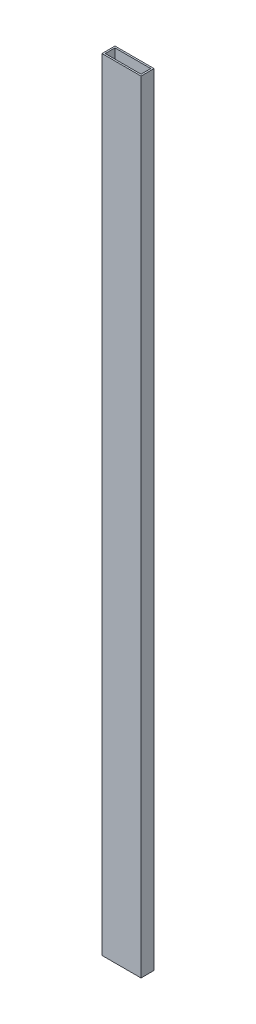
ISO-10303-21;
HEADER;
FILE_DESCRIPTION(('STEP AP214'),'2;1');
FILE_NAME('part.step','',(''),(''),'','','');
FILE_SCHEMA(('AUTOMOTIVE_DESIGN { 1 0 10303 214 1 1 1 1 }'));
ENDSEC;
DATA;
#1=APPLICATION_CONTEXT('core data for automotive mechanical design processes');
#2=APPLICATION_PROTOCOL_DEFINITION('international standard','automotive_design',2000,#1);
#3=PRODUCT_CONTEXT('',#1,'mechanical');
#4=PRODUCT('Part','Part','',(#3));
#5=PRODUCT_RELATED_PRODUCT_CATEGORY('part','',(#4));
#6=PRODUCT_DEFINITION_FORMATION('','',#4);
#7=PRODUCT_DEFINITION_CONTEXT('part definition',#1,'design');
#8=PRODUCT_DEFINITION('design','',#6,#7);
#9=PRODUCT_DEFINITION_SHAPE('','',#8);
#10=(LENGTH_UNIT() NAMED_UNIT(*) SI_UNIT(.MILLI.,.METRE.));
#11=(NAMED_UNIT(*) PLANE_ANGLE_UNIT() SI_UNIT($,.RADIAN.));
#12=(NAMED_UNIT(*) SI_UNIT($,.STERADIAN.) SOLID_ANGLE_UNIT());
#13=UNCERTAINTY_MEASURE_WITH_UNIT(LENGTH_MEASURE(1.E-05),#10,'distance_accuracy_value','');
#14=(GEOMETRIC_REPRESENTATION_CONTEXT(3) GLOBAL_UNCERTAINTY_ASSIGNED_CONTEXT((#13)) GLOBAL_UNIT_ASSIGNED_CONTEXT((#10,
#11,#12)) REPRESENTATION_CONTEXT('',''));
#15=CARTESIAN_POINT('',(0.,0.,0.));
#16=DIRECTION('',(0.,0.,1.));
#17=DIRECTION('',(1.,0.,0.));
#18=AXIS2_PLACEMENT_3D('',#15,#16,#17);
#19=CARTESIAN_POINT('',(0.,1524.,0.));
#20=DIRECTION('',(0.,1.,0.));
#21=DIRECTION('',(0.,0.,1.));
#22=AXIS2_PLACEMENT_3D('',#19,#20,#21);
#23=PLANE('',#22);
#24=DIRECTION('',(0.,0.,-1.));
#25=VECTOR('',#24,1.);
#26=CARTESIAN_POINT('',(0.,1524.,0.));
#27=LINE('',#26,#25);
#28=CARTESIAN_POINT('',(0.,1524.,0.));
#29=VERTEX_POINT('',#28);
#30=CARTESIAN_POINT('',(0.,1524.,-25.4));
#31=VERTEX_POINT('',#30);
#32=EDGE_CURVE('E136',#29,#31,#27,.T.);
#33=ORIENTED_EDGE('',*,*,#32,.T.);
#34=DIRECTION('',(-1.,0.,0.));
#35=VECTOR('',#34,1.);
#36=CARTESIAN_POINT('',(0.,1524.,-25.4));
#37=LINE('',#36,#35);
#38=CARTESIAN_POINT('',(-76.2,1524.,-25.4));
#39=VERTEX_POINT('',#38);
#40=EDGE_CURVE('E139',#31,#39,#37,.T.);
#41=ORIENTED_EDGE('',*,*,#40,.T.);
#42=DIRECTION('',(0.,0.,1.));
#43=VECTOR('',#42,1.);
#44=CARTESIAN_POINT('',(-76.2,1524.,0.));
#45=LINE('',#44,#43);
#46=CARTESIAN_POINT('',(-76.2,1524.,0.));
#47=VERTEX_POINT('',#46);
#48=EDGE_CURVE('E142',#39,#47,#45,.T.);
#49=ORIENTED_EDGE('',*,*,#48,.T.);
#50=DIRECTION('',(1.,0.,0.));
#51=VECTOR('',#50,1.);
#52=CARTESIAN_POINT('',(0.,1524.,0.));
#53=LINE('',#52,#51);
#54=EDGE_CURVE('E144',#47,#29,#53,.T.);
#55=ORIENTED_EDGE('',*,*,#54,.T.);
#56=EDGE_LOOP('',(#33,#41,#49,#55));
#57=FACE_BOUND('',#56,.T.);
#58=DIRECTION('',(1.,0.,0.));
#59=VECTOR('',#58,1.);
#60=CARTESIAN_POINT('',(-73.025,1524.,-3.17499999999999));
#61=LINE('',#60,#59);
#62=CARTESIAN_POINT('',(-73.025,1524.,-3.17499999999999));
#63=VERTEX_POINT('',#62);
#64=CARTESIAN_POINT('',(-3.175,1524.,-3.17499999999999));
#65=VERTEX_POINT('',#64);
#66=EDGE_CURVE('E108',#63,#65,#61,.T.);
#67=ORIENTED_EDGE('',*,*,#66,.F.);
#68=DIRECTION('',(0.,0.,1.));
#69=VECTOR('',#68,1.);
#70=CARTESIAN_POINT('',(-73.025,1524.,-22.225));
#71=LINE('',#70,#69);
#72=CARTESIAN_POINT('',(-73.025,1524.,-22.225));
#73=VERTEX_POINT('',#72);
#74=EDGE_CURVE('E100',#73,#63,#71,.T.);
#75=ORIENTED_EDGE('',*,*,#74,.F.);
#76=DIRECTION('',(-1.,0.,0.));
#77=VECTOR('',#76,1.);
#78=CARTESIAN_POINT('',(-73.025,1524.,-22.225));
#79=LINE('',#78,#77);
#80=CARTESIAN_POINT('',(-3.175,1524.,-22.225));
#81=VERTEX_POINT('',#80);
#82=EDGE_CURVE('E122',#81,#73,#79,.T.);
#83=ORIENTED_EDGE('',*,*,#82,.F.);
#84=DIRECTION('',(0.,0.,-1.));
#85=VECTOR('',#84,1.);
#86=CARTESIAN_POINT('',(-3.175,1524.,-22.225));
#87=LINE('',#86,#85);
#88=EDGE_CURVE('E120',#65,#81,#87,.T.);
#89=ORIENTED_EDGE('',*,*,#88,.F.);
#90=EDGE_LOOP('',(#67,#75,#83,#89));
#91=FACE_BOUND('',#90,.T.);
#92=ADVANCED_FACE('F35',(#57,#91),#23,.T.);
#93=CARTESIAN_POINT('',(0.,0.,0.));
#94=DIRECTION('',(0.,1.,0.));
#95=DIRECTION('',(0.,0.,1.));
#96=AXIS2_PLACEMENT_3D('',#93,#94,#95);
#97=PLANE('',#96);
#98=DIRECTION('',(0.,0.,-1.));
#99=VECTOR('',#98,1.);
#100=CARTESIAN_POINT('',(0.,0.,0.));
#101=LINE('',#100,#99);
#102=CARTESIAN_POINT('',(0.,0.,0.));
#103=VERTEX_POINT('',#102);
#104=CARTESIAN_POINT('',(0.,0.,-25.4));
#105=VERTEX_POINT('',#104);
#106=EDGE_CURVE('E116',#103,#105,#101,.T.);
#107=ORIENTED_EDGE('',*,*,#106,.F.);
#108=DIRECTION('',(1.,0.,0.));
#109=VECTOR('',#108,1.);
#110=CARTESIAN_POINT('',(0.,0.,0.));
#111=LINE('',#110,#109);
#112=CARTESIAN_POINT('',(-76.2,0.,0.));
#113=VERTEX_POINT('',#112);
#114=EDGE_CURVE('E140',#113,#103,#111,.T.);
#115=ORIENTED_EDGE('',*,*,#114,.F.);
#116=DIRECTION('',(0.,0.,1.));
#117=VECTOR('',#116,1.);
#118=CARTESIAN_POINT('',(-76.2,0.,0.));
#119=LINE('',#118,#117);
#120=CARTESIAN_POINT('',(-76.2,0.,-25.4));
#121=VERTEX_POINT('',#120);
#122=EDGE_CURVE('E151',#121,#113,#119,.T.);
#123=ORIENTED_EDGE('',*,*,#122,.F.);
#124=DIRECTION('',(-1.,0.,0.));
#125=VECTOR('',#124,1.);
#126=CARTESIAN_POINT('',(0.,0.,-25.4));
#127=LINE('',#126,#125);
#128=EDGE_CURVE('E149',#105,#121,#127,.T.);
#129=ORIENTED_EDGE('',*,*,#128,.F.);
#130=EDGE_LOOP('',(#107,#115,#123,#129));
#131=FACE_BOUND('',#130,.T.);
#132=DIRECTION('',(0.,0.,1.));
#133=VECTOR('',#132,1.);
#134=CARTESIAN_POINT('',(-73.025,0.,-22.225));
#135=LINE('',#134,#133);
#136=CARTESIAN_POINT('',(-73.025,0.,-22.225));
#137=VERTEX_POINT('',#136);
#138=CARTESIAN_POINT('',(-73.025,0.,-3.17499999999999));
#139=VERTEX_POINT('',#138);
#140=EDGE_CURVE('E58',#137,#139,#135,.T.);
#141=ORIENTED_EDGE('',*,*,#140,.T.);
#142=DIRECTION('',(1.,0.,0.));
#143=VECTOR('',#142,1.);
#144=CARTESIAN_POINT('',(-73.025,0.,-3.17499999999999));
#145=LINE('',#144,#143);
#146=CARTESIAN_POINT('',(-3.175,0.,-3.17499999999999));
#147=VERTEX_POINT('',#146);
#148=EDGE_CURVE('E115',#139,#147,#145,.T.);
#149=ORIENTED_EDGE('',*,*,#148,.T.);
#150=DIRECTION('',(0.,0.,-1.));
#151=VECTOR('',#150,1.);
#152=CARTESIAN_POINT('',(-3.175,0.,-22.225));
#153=LINE('',#152,#151);
#154=CARTESIAN_POINT('',(-3.175,0.,-22.225));
#155=VERTEX_POINT('',#154);
#156=EDGE_CURVE('E128',#147,#155,#153,.T.);
#157=ORIENTED_EDGE('',*,*,#156,.T.);
#158=DIRECTION('',(-1.,0.,0.));
#159=VECTOR('',#158,1.);
#160=CARTESIAN_POINT('',(-73.025,0.,-22.225));
#161=LINE('',#160,#159);
#162=EDGE_CURVE('E109',#155,#137,#161,.T.);
#163=ORIENTED_EDGE('',*,*,#162,.T.);
#164=EDGE_LOOP('',(#141,#149,#157,#163));
#165=FACE_BOUND('',#164,.T.);
#166=ADVANCED_FACE('F169',(#131,#165),#97,.F.);
#167=CARTESIAN_POINT('',(0.,1524.,0.));
#168=DIRECTION('',(-1.,0.,0.));
#169=DIRECTION('',(0.,0.,1.));
#170=AXIS2_PLACEMENT_3D('',#167,#168,#169);
#171=PLANE('',#170);
#172=ORIENTED_EDGE('',*,*,#106,.T.);
#173=DIRECTION('',(0.,-1.,0.));
#174=VECTOR('',#173,1.);
#175=CARTESIAN_POINT('',(0.,1524.,-25.4));
#176=LINE('',#175,#174);
#177=EDGE_CURVE('E11',#31,#105,#176,.T.);
#178=ORIENTED_EDGE('',*,*,#177,.F.);
#179=ORIENTED_EDGE('',*,*,#32,.F.);
#180=DIRECTION('',(0.,-1.,0.));
#181=VECTOR('',#180,1.);
#182=CARTESIAN_POINT('',(0.,1524.,0.));
#183=LINE('',#182,#181);
#184=EDGE_CURVE('E146',#29,#103,#183,.T.);
#185=ORIENTED_EDGE('',*,*,#184,.T.);
#186=EDGE_LOOP('',(#172,#178,#179,#185));
#187=FACE_BOUND('',#186,.T.);
#188=ADVANCED_FACE('F37',(#187),#171,.F.);
#189=CARTESIAN_POINT('',(0.,1524.,-25.4));
#190=DIRECTION('',(0.,0.,1.));
#191=DIRECTION('',(1.,0.,0.));
#192=AXIS2_PLACEMENT_3D('',#189,#190,#191);
#193=PLANE('',#192);
#194=ORIENTED_EDGE('',*,*,#128,.T.);
#195=DIRECTION('',(0.,-1.,0.));
#196=VECTOR('',#195,1.);
#197=CARTESIAN_POINT('',(-76.2,1524.,-25.4));
#198=LINE('',#197,#196);
#199=EDGE_CURVE('E43',#39,#121,#198,.T.);
#200=ORIENTED_EDGE('',*,*,#199,.F.);
#201=ORIENTED_EDGE('',*,*,#40,.F.);
#202=ORIENTED_EDGE('',*,*,#177,.T.);
#203=EDGE_LOOP('',(#194,#200,#201,#202));
#204=FACE_BOUND('',#203,.T.);
#205=ADVANCED_FACE('F179',(#204),#193,.F.);
#206=CARTESIAN_POINT('',(-76.2,1524.,0.));
#207=DIRECTION('',(1.,0.,0.));
#208=DIRECTION('',(0.,0.,-1.));
#209=AXIS2_PLACEMENT_3D('',#206,#207,#208);
#210=PLANE('',#209);
#211=ORIENTED_EDGE('',*,*,#122,.T.);
#212=DIRECTION('',(0.,-1.,0.));
#213=VECTOR('',#212,1.);
#214=CARTESIAN_POINT('',(-76.2,1524.,0.));
#215=LINE('',#214,#213);
#216=EDGE_CURVE('E156',#47,#113,#215,.T.);
#217=ORIENTED_EDGE('',*,*,#216,.F.);
#218=ORIENTED_EDGE('',*,*,#48,.F.);
#219=ORIENTED_EDGE('',*,*,#199,.T.);
#220=EDGE_LOOP('',(#211,#217,#218,#219));
#221=FACE_BOUND('',#220,.T.);
#222=ADVANCED_FACE('F163',(#221),#210,.F.);
#223=CARTESIAN_POINT('',(0.,1524.,0.));
#224=DIRECTION('',(0.,0.,-1.));
#225=DIRECTION('',(-1.,0.,0.));
#226=AXIS2_PLACEMENT_3D('',#223,#224,#225);
#227=PLANE('',#226);
#228=ORIENTED_EDGE('',*,*,#114,.T.);
#229=ORIENTED_EDGE('',*,*,#184,.F.);
#230=ORIENTED_EDGE('',*,*,#54,.F.);
#231=ORIENTED_EDGE('',*,*,#216,.T.);
#232=EDGE_LOOP('',(#228,#229,#230,#231));
#233=FACE_BOUND('',#232,.T.);
#234=ADVANCED_FACE('F173',(#233),#227,.F.);
#235=CARTESIAN_POINT('',(-73.025,1524.,-22.225));
#236=DIRECTION('',(1.,0.,0.));
#237=DIRECTION('',(0.,0.,-1.));
#238=AXIS2_PLACEMENT_3D('',#235,#236,#237);
#239=PLANE('',#238);
#240=ORIENTED_EDGE('',*,*,#140,.F.);
#241=DIRECTION('',(0.,-1.,0.));
#242=VECTOR('',#241,1.);
#243=CARTESIAN_POINT('',(-73.025,1524.,-22.225));
#244=LINE('',#243,#242);
#245=EDGE_CURVE('E104',#73,#137,#244,.T.);
#246=ORIENTED_EDGE('',*,*,#245,.F.);
#247=ORIENTED_EDGE('',*,*,#74,.T.);
#248=DIRECTION('',(0.,-1.,0.));
#249=VECTOR('',#248,1.);
#250=CARTESIAN_POINT('',(-73.025,1524.,-3.17499999999999));
#251=LINE('',#250,#249);
#252=EDGE_CURVE('E103',#63,#139,#251,.T.);
#253=ORIENTED_EDGE('',*,*,#252,.T.);
#254=EDGE_LOOP('',(#240,#246,#247,#253));
#255=FACE_BOUND('',#254,.T.);
#256=ADVANCED_FACE('F102',(#255),#239,.T.);
#257=CARTESIAN_POINT('',(-73.025,1524.,-3.17499999999999));
#258=DIRECTION('',(0.,0.,-1.));
#259=DIRECTION('',(-1.,0.,0.));
#260=AXIS2_PLACEMENT_3D('',#257,#258,#259);
#261=PLANE('',#260);
#262=ORIENTED_EDGE('',*,*,#148,.F.);
#263=ORIENTED_EDGE('',*,*,#252,.F.);
#264=ORIENTED_EDGE('',*,*,#66,.T.);
#265=DIRECTION('',(0.,-1.,0.));
#266=VECTOR('',#265,1.);
#267=CARTESIAN_POINT('',(-3.175,1524.,-3.17499999999999));
#268=LINE('',#267,#266);
#269=EDGE_CURVE('E117',#65,#147,#268,.T.);
#270=ORIENTED_EDGE('',*,*,#269,.T.);
#271=EDGE_LOOP('',(#262,#263,#264,#270));
#272=FACE_BOUND('',#271,.T.);
#273=ADVANCED_FACE('F112',(#272),#261,.T.);
#274=CARTESIAN_POINT('',(-3.175,1524.,-22.225));
#275=DIRECTION('',(-1.,0.,0.));
#276=DIRECTION('',(0.,0.,1.));
#277=AXIS2_PLACEMENT_3D('',#274,#275,#276);
#278=PLANE('',#277);
#279=ORIENTED_EDGE('',*,*,#156,.F.);
#280=ORIENTED_EDGE('',*,*,#269,.F.);
#281=ORIENTED_EDGE('',*,*,#88,.T.);
#282=DIRECTION('',(0.,-1.,0.));
#283=VECTOR('',#282,1.);
#284=CARTESIAN_POINT('',(-3.175,1524.,-22.225));
#285=LINE('',#284,#283);
#286=EDGE_CURVE('E50',#81,#155,#285,.T.);
#287=ORIENTED_EDGE('',*,*,#286,.T.);
#288=EDGE_LOOP('',(#279,#280,#281,#287));
#289=FACE_BOUND('',#288,.T.);
#290=ADVANCED_FACE('F202',(#289),#278,.T.);
#291=CARTESIAN_POINT('',(-73.025,1524.,-22.225));
#292=DIRECTION('',(0.,0.,1.));
#293=DIRECTION('',(1.,0.,0.));
#294=AXIS2_PLACEMENT_3D('',#291,#292,#293);
#295=PLANE('',#294);
#296=ORIENTED_EDGE('',*,*,#162,.F.);
#297=ORIENTED_EDGE('',*,*,#286,.F.);
#298=ORIENTED_EDGE('',*,*,#82,.T.);
#299=ORIENTED_EDGE('',*,*,#245,.T.);
#300=EDGE_LOOP('',(#296,#297,#298,#299));
#301=FACE_BOUND('',#300,.T.);
#302=ADVANCED_FACE('F206',(#301),#295,.T.);
#303=CLOSED_SHELL('',(#92,#166,#188,#205,#222,#234,#256,#273,#290,#302));
#304=MANIFOLD_SOLID_BREP('B2',#303);
#305=ADVANCED_BREP_SHAPE_REPRESENTATION('',(#18,#304),#14);
#306=SHAPE_DEFINITION_REPRESENTATION(#9,#305);
ENDSEC;
END-ISO-10303-21;
